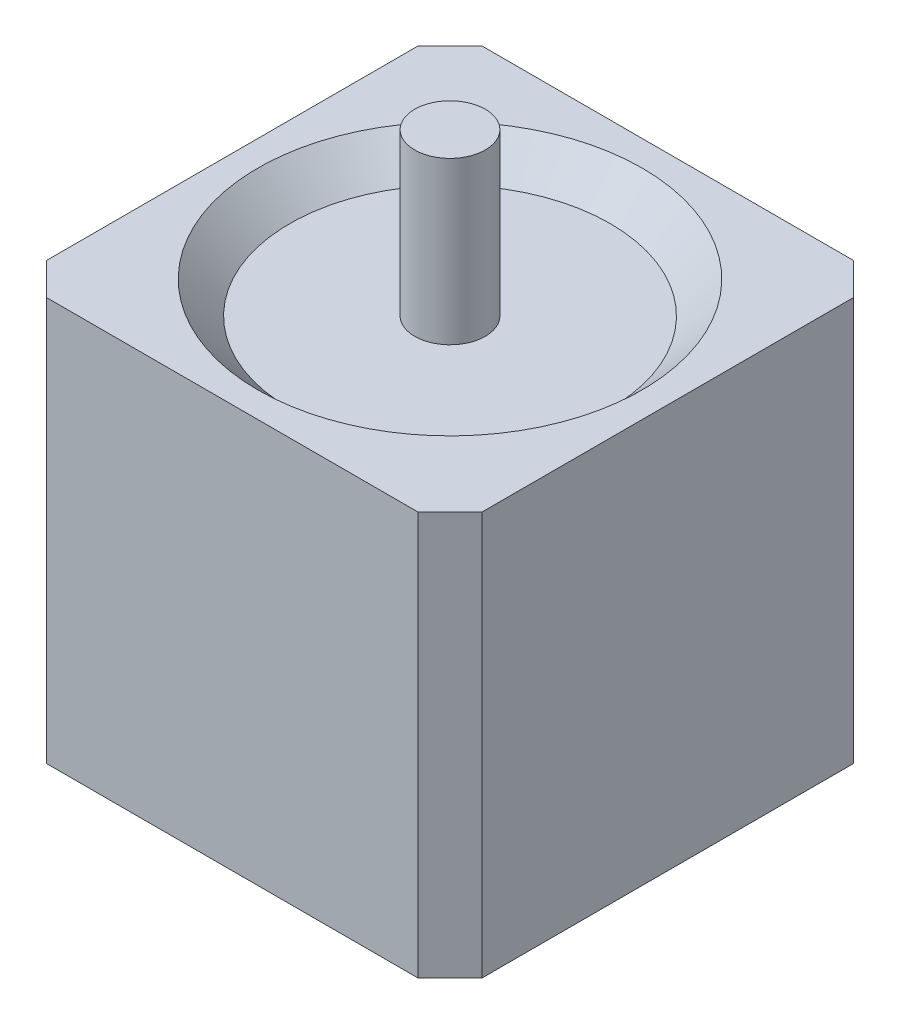
ISO-10303-21;
HEADER;
FILE_DESCRIPTION(('STEP AP214'),'2;1');
FILE_NAME('part.step','',(''),(''),'','','');
FILE_SCHEMA(('AUTOMOTIVE_DESIGN { 1 0 10303 214 1 1 1 1 }'));
ENDSEC;
DATA;
#1=APPLICATION_CONTEXT('core data for automotive mechanical design processes');
#2=APPLICATION_PROTOCOL_DEFINITION('international standard','automotive_design',2000,#1);
#3=PRODUCT_CONTEXT('',#1,'mechanical');
#4=PRODUCT('Part','Part','',(#3));
#5=PRODUCT_RELATED_PRODUCT_CATEGORY('part','',(#4));
#6=PRODUCT_DEFINITION_FORMATION('','',#4);
#7=PRODUCT_DEFINITION_CONTEXT('part definition',#1,'design');
#8=PRODUCT_DEFINITION('design','',#6,#7);
#9=PRODUCT_DEFINITION_SHAPE('','',#8);
#10=(LENGTH_UNIT() NAMED_UNIT(*) SI_UNIT(.MILLI.,.METRE.));
#11=(NAMED_UNIT(*) PLANE_ANGLE_UNIT() SI_UNIT($,.RADIAN.));
#12=(NAMED_UNIT(*) SI_UNIT($,.STERADIAN.) SOLID_ANGLE_UNIT());
#13=UNCERTAINTY_MEASURE_WITH_UNIT(LENGTH_MEASURE(1.E-05),#10,'distance_accuracy_value','');
#14=(GEOMETRIC_REPRESENTATION_CONTEXT(3) GLOBAL_UNCERTAINTY_ASSIGNED_CONTEXT((#13)) GLOBAL_UNIT_ASSIGNED_CONTEXT((#10,
#11,#12)) REPRESENTATION_CONTEXT('',''));
#15=CARTESIAN_POINT('',(0.,0.,0.));
#16=DIRECTION('',(0.,0.,1.));
#17=DIRECTION('',(1.,0.,0.));
#18=AXIS2_PLACEMENT_3D('',#15,#16,#17);
#19=CARTESIAN_POINT('',(43.18,80.01,43.18));
#20=DIRECTION('',(-1.,0.,0.));
#21=DIRECTION('',(0.,0.,1.));
#22=AXIS2_PLACEMENT_3D('',#19,#20,#21);
#23=PLANE('',#22);
#24=DIRECTION('',(0.,0.,-1.));
#25=VECTOR('',#24,1.);
#26=CARTESIAN_POINT('',(43.18,80.01,43.18));
#27=LINE('',#26,#25);
#28=CARTESIAN_POINT('',(43.18,80.01,36.83));
#29=VERTEX_POINT('',#28);
#30=CARTESIAN_POINT('',(43.18,80.01,-36.83));
#31=VERTEX_POINT('',#30);
#32=EDGE_CURVE('E122',#29,#31,#27,.T.);
#33=ORIENTED_EDGE('',*,*,#32,.F.);
#34=DIRECTION('',(0.,-1.,0.));
#35=VECTOR('',#34,1.);
#36=CARTESIAN_POINT('',(43.18,80.01,36.83));
#37=LINE('',#36,#35);
#38=CARTESIAN_POINT('',(43.18,0.,36.83));
#39=VERTEX_POINT('',#38);
#40=EDGE_CURVE('E107',#29,#39,#37,.T.);
#41=ORIENTED_EDGE('',*,*,#40,.T.);
#42=DIRECTION('',(0.,0.,-1.));
#43=VECTOR('',#42,1.);
#44=CARTESIAN_POINT('',(43.18,0.,43.18));
#45=LINE('',#44,#43);
#46=CARTESIAN_POINT('',(43.18,0.,-36.83));
#47=VERTEX_POINT('',#46);
#48=EDGE_CURVE('E119',#39,#47,#45,.T.);
#49=ORIENTED_EDGE('',*,*,#48,.T.);
#50=DIRECTION('',(0.,1.,0.));
#51=VECTOR('',#50,1.);
#52=CARTESIAN_POINT('',(43.18,80.01,-36.83));
#53=LINE('',#52,#51);
#54=EDGE_CURVE('E124',#47,#31,#53,.T.);
#55=ORIENTED_EDGE('',*,*,#54,.T.);
#56=EDGE_LOOP('',(#33,#41,#49,#55));
#57=FACE_BOUND('',#56,.T.);
#58=ADVANCED_FACE('F35',(#57),#23,.F.);
#59=CARTESIAN_POINT('',(-43.18,80.01,-43.18));
#60=DIRECTION('',(0.,0.,1.));
#61=DIRECTION('',(1.,0.,0.));
#62=AXIS2_PLACEMENT_3D('',#59,#60,#61);
#63=PLANE('',#62);
#64=DIRECTION('',(-1.,0.,0.));
#65=VECTOR('',#64,1.);
#66=CARTESIAN_POINT('',(-43.18,0.,-43.18));
#67=LINE('',#66,#65);
#68=CARTESIAN_POINT('',(36.83,0.,-43.18));
#69=VERTEX_POINT('',#68);
#70=CARTESIAN_POINT('',(-36.83,0.,-43.18));
#71=VERTEX_POINT('',#70);
#72=EDGE_CURVE('E128',#69,#71,#67,.T.);
#73=ORIENTED_EDGE('',*,*,#72,.T.);
#74=DIRECTION('',(0.,1.,0.));
#75=VECTOR('',#74,1.);
#76=CARTESIAN_POINT('',(-36.83,80.01,-43.18));
#77=LINE('',#76,#75);
#78=CARTESIAN_POINT('',(-36.83,80.01,-43.18));
#79=VERTEX_POINT('',#78);
#80=EDGE_CURVE('E44',#71,#79,#77,.T.);
#81=ORIENTED_EDGE('',*,*,#80,.T.);
#82=DIRECTION('',(-1.,0.,0.));
#83=VECTOR('',#82,1.);
#84=CARTESIAN_POINT('',(-43.18,80.01,-43.18));
#85=LINE('',#84,#83);
#86=CARTESIAN_POINT('',(36.83,80.01,-43.18));
#87=VERTEX_POINT('',#86);
#88=EDGE_CURVE('E169',#87,#79,#85,.T.);
#89=ORIENTED_EDGE('',*,*,#88,.F.);
#90=DIRECTION('',(0.,-1.,0.));
#91=VECTOR('',#90,1.);
#92=CARTESIAN_POINT('',(36.83,80.01,-43.18));
#93=LINE('',#92,#91);
#94=EDGE_CURVE('E163',#87,#69,#93,.T.);
#95=ORIENTED_EDGE('',*,*,#94,.T.);
#96=EDGE_LOOP('',(#73,#81,#89,#95));
#97=FACE_BOUND('',#96,.T.);
#98=ADVANCED_FACE('F168',(#97),#63,.F.);
#99=CARTESIAN_POINT('',(-43.18,80.01,43.18));
#100=DIRECTION('',(1.,0.,0.));
#101=DIRECTION('',(0.,0.,-1.));
#102=AXIS2_PLACEMENT_3D('',#99,#100,#101);
#103=PLANE('',#102);
#104=DIRECTION('',(0.,0.,1.));
#105=VECTOR('',#104,1.);
#106=CARTESIAN_POINT('',(-43.18,0.,43.18));
#107=LINE('',#106,#105);
#108=CARTESIAN_POINT('',(-43.18,0.,-36.83));
#109=VERTEX_POINT('',#108);
#110=CARTESIAN_POINT('',(-43.18,0.,36.83));
#111=VERTEX_POINT('',#110);
#112=EDGE_CURVE('E132',#109,#111,#107,.T.);
#113=ORIENTED_EDGE('',*,*,#112,.T.);
#114=DIRECTION('',(0.,1.,0.));
#115=VECTOR('',#114,1.);
#116=CARTESIAN_POINT('',(-43.18,80.01,36.83));
#117=LINE('',#116,#115);
#118=CARTESIAN_POINT('',(-43.18,80.01,36.83));
#119=VERTEX_POINT('',#118);
#120=EDGE_CURVE('E51',#111,#119,#117,.T.);
#121=ORIENTED_EDGE('',*,*,#120,.T.);
#122=DIRECTION('',(0.,0.,1.));
#123=VECTOR('',#122,1.);
#124=CARTESIAN_POINT('',(-43.18,80.01,43.18));
#125=LINE('',#124,#123);
#126=CARTESIAN_POINT('',(-43.18,80.01,-36.83));
#127=VERTEX_POINT('',#126);
#128=EDGE_CURVE('E175',#127,#119,#125,.T.);
#129=ORIENTED_EDGE('',*,*,#128,.F.);
#130=DIRECTION('',(0.,-1.,0.));
#131=VECTOR('',#130,1.);
#132=CARTESIAN_POINT('',(-43.18,80.01,-36.83));
#133=LINE('',#132,#131);
#134=EDGE_CURVE('E159',#127,#109,#133,.T.);
#135=ORIENTED_EDGE('',*,*,#134,.T.);
#136=EDGE_LOOP('',(#113,#121,#129,#135));
#137=FACE_BOUND('',#136,.T.);
#138=ADVANCED_FACE('F180',(#137),#103,.F.);
#139=CARTESIAN_POINT('',(-43.18,80.01,43.18));
#140=DIRECTION('',(0.,0.,-1.));
#141=DIRECTION('',(-1.,0.,0.));
#142=AXIS2_PLACEMENT_3D('',#139,#140,#141);
#143=PLANE('',#142);
#144=DIRECTION('',(1.,0.,0.));
#145=VECTOR('',#144,1.);
#146=CARTESIAN_POINT('',(-43.18,0.,43.18));
#147=LINE('',#146,#145);
#148=CARTESIAN_POINT('',(-36.83,0.,43.18));
#149=VERTEX_POINT('',#148);
#150=CARTESIAN_POINT('',(36.83,0.,43.18));
#151=VERTEX_POINT('',#150);
#152=EDGE_CURVE('E142',#149,#151,#147,.T.);
#153=ORIENTED_EDGE('',*,*,#152,.T.);
#154=DIRECTION('',(0.,1.,0.));
#155=VECTOR('',#154,1.);
#156=CARTESIAN_POINT('',(36.83,80.01,43.18));
#157=LINE('',#156,#155);
#158=CARTESIAN_POINT('',(36.83,80.01,43.18));
#159=VERTEX_POINT('',#158);
#160=EDGE_CURVE('E108',#151,#159,#157,.T.);
#161=ORIENTED_EDGE('',*,*,#160,.T.);
#162=DIRECTION('',(1.,0.,0.));
#163=VECTOR('',#162,1.);
#164=CARTESIAN_POINT('',(-43.18,80.01,43.18));
#165=LINE('',#164,#163);
#166=CARTESIAN_POINT('',(-36.83,80.01,43.18));
#167=VERTEX_POINT('',#166);
#168=EDGE_CURVE('E138',#167,#159,#165,.T.);
#169=ORIENTED_EDGE('',*,*,#168,.F.);
#170=DIRECTION('',(0.,-1.,0.));
#171=VECTOR('',#170,1.);
#172=CARTESIAN_POINT('',(-36.83,80.01,43.18));
#173=LINE('',#172,#171);
#174=EDGE_CURVE('E113',#167,#149,#173,.T.);
#175=ORIENTED_EDGE('',*,*,#174,.T.);
#176=EDGE_LOOP('',(#153,#161,#169,#175));
#177=FACE_BOUND('',#176,.T.);
#178=ADVANCED_FACE('F187',(#177),#143,.F.);
#179=CARTESIAN_POINT('',(0.,80.01,0.));
#180=DIRECTION('',(0.,-1.,0.));
#181=DIRECTION('',(0.,0.,-1.));
#182=AXIS2_PLACEMENT_3D('',#179,#180,#181);
#183=PLANE('',#182);
#184=CARTESIAN_POINT('',(0.,80.01,0.));
#185=DIRECTION('',(0.,-1.,0.));
#186=DIRECTION('',(0.,0.,-1.));
#187=AXIS2_PLACEMENT_3D('',#184,#185,#186);
#188=CIRCLE('',#187,38.1);
#189=CARTESIAN_POINT('',(0.,80.01,-38.1));
#190=VERTEX_POINT('',#189);
#191=EDGE_CURVE('E11',#190,#190,#188,.T.);
#192=ORIENTED_EDGE('',*,*,#191,.T.);
#193=EDGE_LOOP('',(#192));
#194=FACE_BOUND('',#193,.T.);
#195=ORIENTED_EDGE('',*,*,#168,.T.);
#196=DIRECTION('',(-0.707106781186549,0.,0.707106781186546));
#197=VECTOR('',#196,1.);
#198=CARTESIAN_POINT('',(43.18,80.01,36.83));
#199=LINE('',#198,#197);
#200=EDGE_CURVE('E157',#159,#29,#199,.F.);
#201=ORIENTED_EDGE('',*,*,#200,.T.);
#202=ORIENTED_EDGE('',*,*,#32,.T.);
#203=DIRECTION('',(0.707106781186546,0.,0.707106781186549));
#204=VECTOR('',#203,1.);
#205=CARTESIAN_POINT('',(36.83,80.01,-43.18));
#206=LINE('',#205,#204);
#207=EDGE_CURVE('E152',#31,#87,#206,.F.);
#208=ORIENTED_EDGE('',*,*,#207,.T.);
#209=ORIENTED_EDGE('',*,*,#88,.T.);
#210=DIRECTION('',(0.707106781186549,0.,-0.707106781186546));
#211=VECTOR('',#210,1.);
#212=CARTESIAN_POINT('',(-43.18,80.01,-36.83));
#213=LINE('',#212,#211);
#214=EDGE_CURVE('E58',#79,#127,#213,.F.);
#215=ORIENTED_EDGE('',*,*,#214,.T.);
#216=ORIENTED_EDGE('',*,*,#128,.T.);
#217=DIRECTION('',(-0.707106781186546,0.,-0.707106781186549));
#218=VECTOR('',#217,1.);
#219=CARTESIAN_POINT('',(-36.83,80.01,43.18));
#220=LINE('',#219,#218);
#221=EDGE_CURVE('E155',#119,#167,#220,.F.);
#222=ORIENTED_EDGE('',*,*,#221,.T.);
#223=EDGE_LOOP('',(#195,#201,#202,#208,#209,#215,#216,#222));
#224=FACE_BOUND('',#223,.T.);
#225=ADVANCED_FACE('F173',(#194,#224),#183,.F.);
#226=CARTESIAN_POINT('',(0.,0.,0.));
#227=DIRECTION('',(0.,-1.,0.));
#228=DIRECTION('',(0.,0.,-1.));
#229=AXIS2_PLACEMENT_3D('',#226,#227,#228);
#230=PLANE('',#229);
#231=ORIENTED_EDGE('',*,*,#48,.F.);
#232=DIRECTION('',(0.707106781186549,0.,-0.707106781186546));
#233=VECTOR('',#232,1.);
#234=CARTESIAN_POINT('',(40.0049999999999,0.,40.0050000000001));
#235=LINE('',#234,#233);
#236=EDGE_CURVE('E103',#39,#151,#235,.F.);
#237=ORIENTED_EDGE('',*,*,#236,.T.);
#238=ORIENTED_EDGE('',*,*,#152,.F.);
#239=DIRECTION('',(0.707106781186546,0.,0.707106781186549));
#240=VECTOR('',#239,1.);
#241=CARTESIAN_POINT('',(-40.0050000000001,0.,40.0049999999999));
#242=LINE('',#241,#240);
#243=EDGE_CURVE('E114',#149,#111,#242,.F.);
#244=ORIENTED_EDGE('',*,*,#243,.T.);
#245=ORIENTED_EDGE('',*,*,#112,.F.);
#246=DIRECTION('',(-0.707106781186549,0.,0.707106781186546));
#247=VECTOR('',#246,1.);
#248=CARTESIAN_POINT('',(-40.0049999999999,0.,-40.0050000000001));
#249=LINE('',#248,#247);
#250=EDGE_CURVE('E146',#109,#71,#249,.F.);
#251=ORIENTED_EDGE('',*,*,#250,.T.);
#252=ORIENTED_EDGE('',*,*,#72,.F.);
#253=DIRECTION('',(-0.707106781186546,0.,-0.707106781186549));
#254=VECTOR('',#253,1.);
#255=CARTESIAN_POINT('',(40.0050000000001,0.,-40.0049999999999));
#256=LINE('',#255,#254);
#257=EDGE_CURVE('E123',#69,#47,#256,.F.);
#258=ORIENTED_EDGE('',*,*,#257,.T.);
#259=EDGE_LOOP('',(#231,#237,#238,#244,#245,#251,#252,#258));
#260=FACE_BOUND('',#259,.T.);
#261=ADVANCED_FACE('F126',(#260),#230,.T.);
#262=CARTESIAN_POINT('',(0.,73.66,0.));
#263=DIRECTION('',(0.,1.,0.));
#264=DIRECTION('',(0.,0.,1.));
#265=AXIS2_PLACEMENT_3D('',#262,#263,#264);
#266=PLANE('',#265);
#267=CARTESIAN_POINT('',(0.,73.66,0.));
#268=DIRECTION('',(0.,1.,0.));
#269=DIRECTION('',(0.,0.,1.));
#270=AXIS2_PLACEMENT_3D('',#267,#268,#269);
#271=CIRCLE('',#270,6.99897);
#272=CARTESIAN_POINT('',(0.,73.66,6.99897));
#273=VERTEX_POINT('',#272);
#274=EDGE_CURVE('E190',#273,#273,#271,.T.);
#275=ORIENTED_EDGE('',*,*,#274,.F.);
#276=EDGE_LOOP('',(#275));
#277=FACE_BOUND('',#276,.T.);
#278=CARTESIAN_POINT('',(0.,73.66,0.));
#279=DIRECTION('',(0.,1.,0.));
#280=DIRECTION('',(0.,0.,1.));
#281=AXIS2_PLACEMENT_3D('',#278,#279,#280);
#282=CIRCLE('',#281,31.75);
#283=CARTESIAN_POINT('',(0.,73.66,31.75));
#284=VERTEX_POINT('',#283);
#285=EDGE_CURVE('E129',#284,#284,#282,.T.);
#286=ORIENTED_EDGE('',*,*,#285,.T.);
#287=EDGE_LOOP('',(#286));
#288=FACE_BOUND('',#287,.T.);
#289=ADVANCED_FACE('F205',(#277,#288),#266,.T.);
#290=CARTESIAN_POINT('',(43.18,80.01,36.83));
#291=DIRECTION('',(-0.707106781186546,0.,-0.707106781186549));
#292=DIRECTION('',(0.,-1.,0.));
#293=AXIS2_PLACEMENT_3D('',#290,#291,#292);
#294=PLANE('',#293);
#295=ORIENTED_EDGE('',*,*,#200,.F.);
#296=ORIENTED_EDGE('',*,*,#160,.F.);
#297=ORIENTED_EDGE('',*,*,#236,.F.);
#298=ORIENTED_EDGE('',*,*,#40,.F.);
#299=EDGE_LOOP('',(#295,#296,#297,#298));
#300=FACE_BOUND('',#299,.T.);
#301=ADVANCED_FACE('F106',(#300),#294,.F.);
#302=CARTESIAN_POINT('',(-36.83,80.01,43.18));
#303=DIRECTION('',(0.707106781186549,0.,-0.707106781186546));
#304=DIRECTION('',(0.,-1.,0.));
#305=AXIS2_PLACEMENT_3D('',#302,#303,#304);
#306=PLANE('',#305);
#307=ORIENTED_EDGE('',*,*,#221,.F.);
#308=ORIENTED_EDGE('',*,*,#120,.F.);
#309=ORIENTED_EDGE('',*,*,#243,.F.);
#310=ORIENTED_EDGE('',*,*,#174,.F.);
#311=EDGE_LOOP('',(#307,#308,#309,#310));
#312=FACE_BOUND('',#311,.T.);
#313=ADVANCED_FACE('F184',(#312),#306,.F.);
#314=CARTESIAN_POINT('',(-43.18,80.01,-36.83));
#315=DIRECTION('',(0.707106781186546,0.,0.707106781186549));
#316=DIRECTION('',(0.,-1.,0.));
#317=AXIS2_PLACEMENT_3D('',#314,#315,#316);
#318=PLANE('',#317);
#319=ORIENTED_EDGE('',*,*,#214,.F.);
#320=ORIENTED_EDGE('',*,*,#80,.F.);
#321=ORIENTED_EDGE('',*,*,#250,.F.);
#322=ORIENTED_EDGE('',*,*,#134,.F.);
#323=EDGE_LOOP('',(#319,#320,#321,#322));
#324=FACE_BOUND('',#323,.T.);
#325=ADVANCED_FACE('F178',(#324),#318,.F.);
#326=CARTESIAN_POINT('',(36.83,80.01,-43.18));
#327=DIRECTION('',(-0.707106781186549,0.,0.707106781186546));
#328=DIRECTION('',(0.,-1.,0.));
#329=AXIS2_PLACEMENT_3D('',#326,#327,#328);
#330=PLANE('',#329);
#331=ORIENTED_EDGE('',*,*,#207,.F.);
#332=ORIENTED_EDGE('',*,*,#54,.F.);
#333=ORIENTED_EDGE('',*,*,#257,.F.);
#334=ORIENTED_EDGE('',*,*,#94,.F.);
#335=EDGE_LOOP('',(#331,#332,#333,#334));
#336=FACE_BOUND('',#335,.T.);
#337=ADVANCED_FACE('F201',(#336),#330,.F.);
#338=CARTESIAN_POINT('',(0.,105.664,0.));
#339=DIRECTION('',(0.,-1.,0.));
#340=DIRECTION('',(0.,0.,-1.));
#341=AXIS2_PLACEMENT_3D('',#338,#339,#340);
#342=CYLINDRICAL_SURFACE('',#341,6.99897);
#343=CARTESIAN_POINT('',(0.,105.664,0.));
#344=DIRECTION('',(0.,1.,0.));
#345=DIRECTION('',(0.,0.,1.));
#346=AXIS2_PLACEMENT_3D('',#343,#344,#345);
#347=CIRCLE('',#346,6.99897);
#348=CARTESIAN_POINT('',(0.,105.664,6.99897));
#349=VERTEX_POINT('',#348);
#350=EDGE_CURVE('E135',#349,#349,#347,.T.);
#351=ORIENTED_EDGE('',*,*,#350,.F.);
#352=EDGE_LOOP('',(#351));
#353=FACE_BOUND('',#352,.T.);
#354=ORIENTED_EDGE('',*,*,#274,.T.);
#355=EDGE_LOOP('',(#354));
#356=FACE_BOUND('',#355,.T.);
#357=ADVANCED_FACE('F198',(#353,#356),#342,.T.);
#358=CARTESIAN_POINT('',(0.,105.664,0.));
#359=DIRECTION('',(0.,1.,0.));
#360=DIRECTION('',(0.,0.,1.));
#361=AXIS2_PLACEMENT_3D('',#358,#359,#360);
#362=PLANE('',#361);
#363=ORIENTED_EDGE('',*,*,#350,.T.);
#364=EDGE_LOOP('',(#363));
#365=FACE_BOUND('',#364,.T.);
#366=ADVANCED_FACE('F196',(#365),#362,.T.);
#367=CARTESIAN_POINT('',(0.,73.66,0.));
#368=DIRECTION('',(0.,1.,0.));
#369=DIRECTION('',(0.,0.,1.));
#370=AXIS2_PLACEMENT_3D('',#367,#368,#369);
#371=CONICAL_SURFACE('',#370,31.75,0.78539816339745);
#372=ORIENTED_EDGE('',*,*,#191,.F.);
#373=EDGE_LOOP('',(#372));
#374=FACE_BOUND('',#373,.T.);
#375=ORIENTED_EDGE('',*,*,#285,.F.);
#376=EDGE_LOOP('',(#375));
#377=FACE_BOUND('',#376,.T.);
#378=ADVANCED_FACE('F38',(#374,#377),#371,.F.);
#379=CLOSED_SHELL('',(#58,#98,#138,#178,#225,#261,#289,#301,#313,#325,#337,#357,#366,#378));
#380=MANIFOLD_SOLID_BREP('B2',#379);
#381=ADVANCED_BREP_SHAPE_REPRESENTATION('',(#18,#380),#14);
#382=SHAPE_DEFINITION_REPRESENTATION(#9,#381);
ENDSEC;
END-ISO-10303-21;
